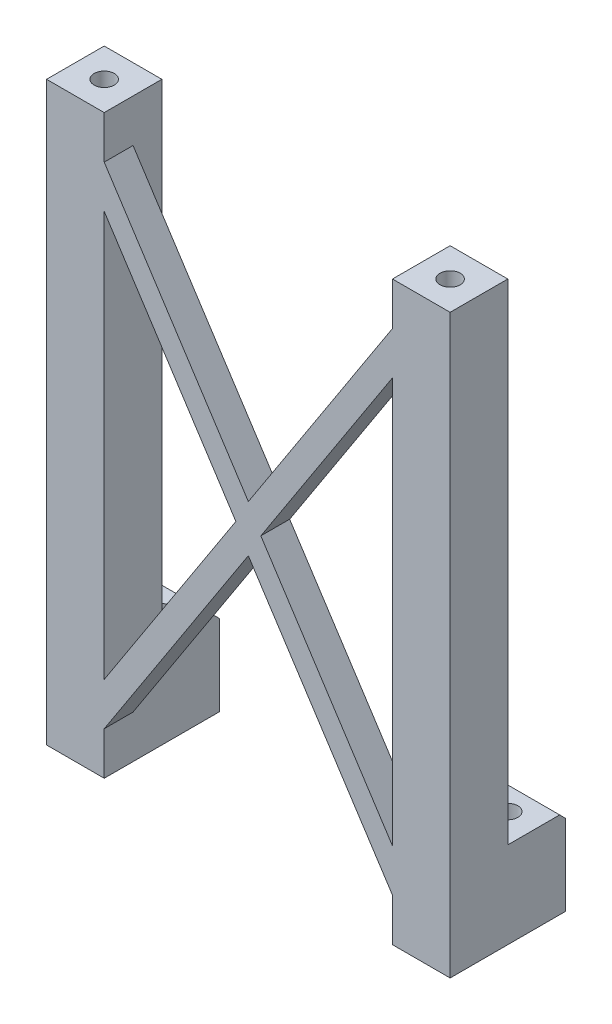
ISO-10303-21;
HEADER;
FILE_DESCRIPTION(('STEP AP214'),'2;1');
FILE_NAME('part.step','',(''),(''),'','','');
FILE_SCHEMA(('AUTOMOTIVE_DESIGN { 1 0 10303 214 1 1 1 1 }'));
ENDSEC;
DATA;
#1=APPLICATION_CONTEXT('core data for automotive mechanical design processes');
#2=APPLICATION_PROTOCOL_DEFINITION('international standard','automotive_design',2000,#1);
#3=PRODUCT_CONTEXT('',#1,'mechanical');
#4=PRODUCT('Part','Part','',(#3));
#5=PRODUCT_RELATED_PRODUCT_CATEGORY('part','',(#4));
#6=PRODUCT_DEFINITION_FORMATION('','',#4);
#7=PRODUCT_DEFINITION_CONTEXT('part definition',#1,'design');
#8=PRODUCT_DEFINITION('design','',#6,#7);
#9=PRODUCT_DEFINITION_SHAPE('','',#8);
#10=(LENGTH_UNIT() NAMED_UNIT(*) SI_UNIT(.MILLI.,.METRE.));
#11=(NAMED_UNIT(*) PLANE_ANGLE_UNIT() SI_UNIT($,.RADIAN.));
#12=(NAMED_UNIT(*) SI_UNIT($,.STERADIAN.) SOLID_ANGLE_UNIT());
#13=UNCERTAINTY_MEASURE_WITH_UNIT(LENGTH_MEASURE(1.E-05),#10,'distance_accuracy_value','');
#14=(GEOMETRIC_REPRESENTATION_CONTEXT(3) GLOBAL_UNCERTAINTY_ASSIGNED_CONTEXT((#13)) GLOBAL_UNIT_ASSIGNED_CONTEXT((#10,
#11,#12)) REPRESENTATION_CONTEXT('',''));
#15=CARTESIAN_POINT('',(0.,0.,0.));
#16=DIRECTION('',(0.,0.,1.));
#17=DIRECTION('',(1.,0.,0.));
#18=AXIS2_PLACEMENT_3D('',#15,#16,#17);
#19=CARTESIAN_POINT('',(25.,50.,-5.));
#20=DIRECTION('',(1.,0.,0.));
#21=DIRECTION('',(0.,0.,-1.));
#22=AXIS2_PLACEMENT_3D('',#19,#20,#21);
#23=PLANE('',#22);
#24=DIRECTION('',(0.,0.,-1.));
#25=VECTOR('',#24,1.);
#26=CARTESIAN_POINT('',(25.,-35.,-5.));
#27=LINE('',#26,#25);
#28=CARTESIAN_POINT('',(25.,-35.,-5.));
#29=VERTEX_POINT('',#28);
#30=CARTESIAN_POINT('',(25.,-35.,-14.));
#31=VERTEX_POINT('',#30);
#32=EDGE_CURVE('E258',#29,#31,#27,.T.);
#33=ORIENTED_EDGE('',*,*,#32,.T.);
#34=DIRECTION('',(0.,0.707106781186543,0.707106781186552));
#35=VECTOR('',#34,1.);
#36=CARTESIAN_POINT('',(25.,-36.,-15.));
#37=LINE('',#36,#35);
#38=CARTESIAN_POINT('',(25.,-36.,-15.));
#39=VERTEX_POINT('',#38);
#40=EDGE_CURVE('E11',#31,#39,#37,.F.);
#41=ORIENTED_EDGE('',*,*,#40,.T.);
#42=DIRECTION('',(0.,-1.,0.));
#43=VECTOR('',#42,1.);
#44=CARTESIAN_POINT('',(25.,-35.,-15.));
#45=LINE('',#44,#43);
#46=CARTESIAN_POINT('',(25.,-50.,-15.));
#47=VERTEX_POINT('',#46);
#48=EDGE_CURVE('E260',#39,#47,#45,.T.);
#49=ORIENTED_EDGE('',*,*,#48,.T.);
#50=DIRECTION('',(0.,0.,1.));
#51=VECTOR('',#50,1.);
#52=CARTESIAN_POINT('',(25.,-50.,-5.));
#53=LINE('',#52,#51);
#54=CARTESIAN_POINT('',(25.,-50.,5.));
#55=VERTEX_POINT('',#54);
#56=EDGE_CURVE('E294',#47,#55,#53,.T.);
#57=ORIENTED_EDGE('',*,*,#56,.T.);
#58=DIRECTION('',(0.,1.,0.));
#59=VECTOR('',#58,1.);
#60=CARTESIAN_POINT('',(25.,-50.,5.));
#61=LINE('',#60,#59);
#62=CARTESIAN_POINT('',(25.,-42.5553559480448,5.));
#63=VERTEX_POINT('',#62);
#64=EDGE_CURVE('E300',#55,#63,#61,.T.);
#65=ORIENTED_EDGE('',*,*,#64,.T.);
#66=DIRECTION('',(0.,0.,-1.));
#67=VECTOR('',#66,1.);
#68=CARTESIAN_POINT('',(25.,-42.5553559480448,54.3554284741283));
#69=LINE('',#68,#67);
#70=CARTESIAN_POINT('',(25.,-42.5553559480448,0.));
#71=VERTEX_POINT('',#70);
#72=EDGE_CURVE('E281',#63,#71,#69,.T.);
#73=ORIENTED_EDGE('',*,*,#72,.T.);
#74=DIRECTION('',(0.,-1.,0.));
#75=VECTOR('',#74,1.);
#76=CARTESIAN_POINT('',(25.,-42.5553559480448,0.));
#77=LINE('',#76,#75);
#78=CARTESIAN_POINT('',(25.,-35.1545796982905,0.));
#79=VERTEX_POINT('',#78);
#80=EDGE_CURVE('E275',#79,#71,#77,.T.);
#81=ORIENTED_EDGE('',*,*,#80,.F.);
#82=DIRECTION('',(0.,0.,-1.));
#83=VECTOR('',#82,1.);
#84=CARTESIAN_POINT('',(25.,-35.1545796982905,54.3554284741283));
#85=LINE('',#84,#83);
#86=CARTESIAN_POINT('',(25.,-35.1545796982905,5.));
#87=VERTEX_POINT('',#86);
#88=EDGE_CURVE('E284',#87,#79,#85,.T.);
#89=ORIENTED_EDGE('',*,*,#88,.F.);
#90=DIRECTION('',(0.,-1.,0.));
#91=VECTOR('',#90,1.);
#92=CARTESIAN_POINT('',(25.,50.,5.));
#93=LINE('',#92,#91);
#94=CARTESIAN_POINT('',(25.,35.1545796982905,5.));
#95=VERTEX_POINT('',#94);
#96=EDGE_CURVE('E335',#95,#87,#93,.T.);
#97=ORIENTED_EDGE('',*,*,#96,.F.);
#98=DIRECTION('',(0.,0.,-1.));
#99=VECTOR('',#98,1.);
#100=CARTESIAN_POINT('',(25.,35.1545796982905,54.3554284741283));
#101=LINE('',#100,#99);
#102=CARTESIAN_POINT('',(25.,35.1545796982905,0.));
#103=VERTEX_POINT('',#102);
#104=EDGE_CURVE('E307',#95,#103,#101,.T.);
#105=ORIENTED_EDGE('',*,*,#104,.T.);
#106=DIRECTION('',(0.,1.,0.));
#107=VECTOR('',#106,1.);
#108=CARTESIAN_POINT('',(25.,42.5553559480448,0.));
#109=LINE('',#108,#107);
#110=CARTESIAN_POINT('',(25.,42.5553559480448,0.));
#111=VERTEX_POINT('',#110);
#112=EDGE_CURVE('E312',#103,#111,#109,.T.);
#113=ORIENTED_EDGE('',*,*,#112,.T.);
#114=DIRECTION('',(0.,0.,-1.));
#115=VECTOR('',#114,1.);
#116=CARTESIAN_POINT('',(25.,42.5553559480448,54.3554284741283));
#117=LINE('',#116,#115);
#118=CARTESIAN_POINT('',(25.,42.5553559480448,5.));
#119=VERTEX_POINT('',#118);
#120=EDGE_CURVE('E317',#119,#111,#117,.T.);
#121=ORIENTED_EDGE('',*,*,#120,.F.);
#122=CARTESIAN_POINT('',(25.,50.,5.));
#123=VERTEX_POINT('',#122);
#124=EDGE_CURVE('E336',#123,#119,#93,.T.);
#125=ORIENTED_EDGE('',*,*,#124,.F.);
#126=DIRECTION('',(0.,0.,1.));
#127=VECTOR('',#126,1.);
#128=CARTESIAN_POINT('',(25.,50.,-5.));
#129=LINE('',#128,#127);
#130=CARTESIAN_POINT('',(25.,50.,-5.));
#131=VERTEX_POINT('',#130);
#132=EDGE_CURVE('E329',#131,#123,#129,.T.);
#133=ORIENTED_EDGE('',*,*,#132,.F.);
#134=DIRECTION('',(0.,-1.,0.));
#135=VECTOR('',#134,1.);
#136=CARTESIAN_POINT('',(25.,50.,-5.));
#137=LINE('',#136,#135);
#138=EDGE_CURVE('E339',#131,#29,#137,.T.);
#139=ORIENTED_EDGE('',*,*,#138,.T.);
#140=EDGE_LOOP('',(#33,#41,#49,#57,#65,#73,#81,#89,#97,#105,#113,#121,#125,#133,#139));
#141=FACE_BOUND('',#140,.T.);
#142=ADVANCED_FACE('F36',(#141),#23,.F.);
#143=CARTESIAN_POINT('',(0.,50.,0.));
#144=DIRECTION('',(0.,1.,0.));
#145=DIRECTION('',(0.,0.,1.));
#146=AXIS2_PLACEMENT_3D('',#143,#144,#145);
#147=PLANE('',#146);
#148=DIRECTION('',(0.,0.,-1.));
#149=VECTOR('',#148,1.);
#150=CARTESIAN_POINT('',(35.,50.,-5.));
#151=LINE('',#150,#149);
#152=CARTESIAN_POINT('',(35.,50.,5.));
#153=VERTEX_POINT('',#152);
#154=CARTESIAN_POINT('',(35.,50.,-5.));
#155=VERTEX_POINT('',#154);
#156=EDGE_CURVE('E324',#153,#155,#151,.T.);
#157=ORIENTED_EDGE('',*,*,#156,.T.);
#158=DIRECTION('',(-1.,0.,0.));
#159=VECTOR('',#158,1.);
#160=CARTESIAN_POINT('',(25.,50.,-5.));
#161=LINE('',#160,#159);
#162=EDGE_CURVE('E327',#155,#131,#161,.T.);
#163=ORIENTED_EDGE('',*,*,#162,.T.);
#164=ORIENTED_EDGE('',*,*,#132,.T.);
#165=DIRECTION('',(1.,0.,0.));
#166=VECTOR('',#165,1.);
#167=CARTESIAN_POINT('',(25.,50.,5.));
#168=LINE('',#167,#166);
#169=EDGE_CURVE('E331',#123,#153,#168,.T.);
#170=ORIENTED_EDGE('',*,*,#169,.T.);
#171=EDGE_LOOP('',(#157,#163,#164,#170));
#172=FACE_BOUND('',#171,.T.);
#173=CARTESIAN_POINT('',(30.,50.,0.));
#174=DIRECTION('',(0.,1.,0.));
#175=DIRECTION('',(0.,0.,1.));
#176=AXIS2_PLACEMENT_3D('',#173,#174,#175);
#177=CIRCLE('',#176,1.75);
#178=CARTESIAN_POINT('',(30.,50.,1.75));
#179=VERTEX_POINT('',#178);
#180=EDGE_CURVE('E310',#179,#179,#177,.T.);
#181=ORIENTED_EDGE('',*,*,#180,.F.);
#182=EDGE_LOOP('',(#181));
#183=FACE_BOUND('',#182,.T.);
#184=ADVANCED_FACE('F380',(#172,#183),#147,.T.);
#185=CARTESIAN_POINT('',(35.,50.,-5.));
#186=DIRECTION('',(-1.,0.,0.));
#187=DIRECTION('',(0.,0.,1.));
#188=AXIS2_PLACEMENT_3D('',#185,#186,#187);
#189=PLANE('',#188);
#190=DIRECTION('',(0.,-1.,0.));
#191=VECTOR('',#190,1.);
#192=CARTESIAN_POINT('',(35.,-35.,-15.));
#193=LINE('',#192,#191);
#194=CARTESIAN_POINT('',(35.,-36.,-15.));
#195=VERTEX_POINT('',#194);
#196=CARTESIAN_POINT('',(35.,-50.,-15.));
#197=VERTEX_POINT('',#196);
#198=EDGE_CURVE('E263',#195,#197,#193,.T.);
#199=ORIENTED_EDGE('',*,*,#198,.F.);
#200=DIRECTION('',(0.,-0.707106781186543,-0.707106781186552));
#201=VECTOR('',#200,1.);
#202=CARTESIAN_POINT('',(35.,-36.,-15.));
#203=LINE('',#202,#201);
#204=CARTESIAN_POINT('',(35.,-35.,-14.));
#205=VERTEX_POINT('',#204);
#206=EDGE_CURVE('E58',#195,#205,#203,.F.);
#207=ORIENTED_EDGE('',*,*,#206,.T.);
#208=DIRECTION('',(0.,0.,1.));
#209=VECTOR('',#208,1.);
#210=CARTESIAN_POINT('',(35.,-35.,-5.));
#211=LINE('',#210,#209);
#212=CARTESIAN_POINT('',(35.,-35.,-5.));
#213=VERTEX_POINT('',#212);
#214=EDGE_CURVE('E253',#205,#213,#211,.T.);
#215=ORIENTED_EDGE('',*,*,#214,.T.);
#216=DIRECTION('',(0.,-1.,0.));
#217=VECTOR('',#216,1.);
#218=CARTESIAN_POINT('',(35.,50.,-5.));
#219=LINE('',#218,#217);
#220=EDGE_CURVE('E342',#155,#213,#219,.T.);
#221=ORIENTED_EDGE('',*,*,#220,.F.);
#222=ORIENTED_EDGE('',*,*,#156,.F.);
#223=DIRECTION('',(0.,-1.,0.));
#224=VECTOR('',#223,1.);
#225=CARTESIAN_POINT('',(35.,50.,5.));
#226=LINE('',#225,#224);
#227=CARTESIAN_POINT('',(35.,-50.,5.));
#228=VERTEX_POINT('',#227);
#229=EDGE_CURVE('E333',#153,#228,#226,.T.);
#230=ORIENTED_EDGE('',*,*,#229,.T.);
#231=DIRECTION('',(0.,0.,-1.));
#232=VECTOR('',#231,1.);
#233=CARTESIAN_POINT('',(35.,-50.,-5.));
#234=LINE('',#233,#232);
#235=EDGE_CURVE('E291',#228,#197,#234,.T.);
#236=ORIENTED_EDGE('',*,*,#235,.T.);
#237=EDGE_LOOP('',(#199,#207,#215,#221,#222,#230,#236));
#238=FACE_BOUND('',#237,.T.);
#239=ADVANCED_FACE('F355',(#238),#189,.F.);
#240=CARTESIAN_POINT('',(25.,50.,-5.));
#241=DIRECTION('',(0.,0.,1.));
#242=DIRECTION('',(1.,0.,0.));
#243=AXIS2_PLACEMENT_3D('',#240,#241,#242);
#244=PLANE('',#243);
#245=ORIENTED_EDGE('',*,*,#220,.T.);
#246=DIRECTION('',(-1.,0.,0.));
#247=VECTOR('',#246,1.);
#248=CARTESIAN_POINT('',(35.,-35.,-5.));
#249=LINE('',#248,#247);
#250=EDGE_CURVE('E255',#213,#29,#249,.T.);
#251=ORIENTED_EDGE('',*,*,#250,.T.);
#252=ORIENTED_EDGE('',*,*,#138,.F.);
#253=ORIENTED_EDGE('',*,*,#162,.F.);
#254=EDGE_LOOP('',(#245,#251,#252,#253));
#255=FACE_BOUND('',#254,.T.);
#256=ADVANCED_FACE('F390',(#255),#244,.F.);
#257=CARTESIAN_POINT('',(25.,50.,5.));
#258=DIRECTION('',(0.,0.,-1.));
#259=DIRECTION('',(-1.,0.,0.));
#260=AXIS2_PLACEMENT_3D('',#257,#258,#259);
#261=PLANE('',#260);
#262=DIRECTION('',(1.,0.,0.));
#263=VECTOR('',#262,1.);
#264=CARTESIAN_POINT('',(25.,-50.,5.));
#265=LINE('',#264,#263);
#266=EDGE_CURVE('E297',#55,#228,#265,.T.);
#267=ORIENTED_EDGE('',*,*,#266,.T.);
#268=ORIENTED_EDGE('',*,*,#229,.F.);
#269=ORIENTED_EDGE('',*,*,#169,.F.);
#270=ORIENTED_EDGE('',*,*,#124,.T.);
#271=DIRECTION('',(0.544715045536134,0.838621201238418,0.));
#272=VECTOR('',#271,1.);
#273=CARTESIAN_POINT('',(0.,4.0663694536013,5.));
#274=LINE('',#273,#272);
#275=CARTESIAN_POINT('',(0.,4.0663694536013,5.00000000000001));
#276=VERTEX_POINT('',#275);
#277=EDGE_CURVE('E304',#276,#119,#274,.T.);
#278=ORIENTED_EDGE('',*,*,#277,.F.);
#279=DIRECTION('',(-0.544715045536134,0.838621201238418,0.));
#280=VECTOR('',#279,1.);
#281=CARTESIAN_POINT('',(0.,4.0663694536013,5.));
#282=LINE('',#281,#280);
#283=CARTESIAN_POINT('',(-25.,42.5553559480448,5.));
#284=VERTEX_POINT('',#283);
#285=EDGE_CURVE('E752',#276,#284,#282,.T.);
#286=ORIENTED_EDGE('',*,*,#285,.T.);
#287=DIRECTION('',(0.,-1.,0.));
#288=VECTOR('',#287,1.);
#289=CARTESIAN_POINT('',(-25.,50.,5.));
#290=LINE('',#289,#288);
#291=CARTESIAN_POINT('',(-25.,50.,5.));
#292=VERTEX_POINT('',#291);
#293=EDGE_CURVE('E237',#292,#284,#290,.T.);
#294=ORIENTED_EDGE('',*,*,#293,.F.);
#295=DIRECTION('',(-1.,0.,0.));
#296=VECTOR('',#295,1.);
#297=CARTESIAN_POINT('',(-25.,50.,5.));
#298=LINE('',#297,#296);
#299=CARTESIAN_POINT('',(-35.,50.,5.));
#300=VERTEX_POINT('',#299);
#301=EDGE_CURVE('E782',#292,#300,#298,.T.);
#302=ORIENTED_EDGE('',*,*,#301,.T.);
#303=DIRECTION('',(0.,-1.,0.));
#304=VECTOR('',#303,1.);
#305=CARTESIAN_POINT('',(-35.,50.,5.));
#306=LINE('',#305,#304);
#307=CARTESIAN_POINT('',(-35.,-50.,5.));
#308=VERTEX_POINT('',#307);
#309=EDGE_CURVE('E785',#300,#308,#306,.T.);
#310=ORIENTED_EDGE('',*,*,#309,.T.);
#311=DIRECTION('',(-1.,0.,0.));
#312=VECTOR('',#311,1.);
#313=CARTESIAN_POINT('',(-25.,-50.,5.));
#314=LINE('',#313,#312);
#315=CARTESIAN_POINT('',(-25.,-50.,5.));
#316=VERTEX_POINT('',#315);
#317=EDGE_CURVE('E746',#316,#308,#314,.T.);
#318=ORIENTED_EDGE('',*,*,#317,.F.);
#319=DIRECTION('',(0.,1.,0.));
#320=VECTOR('',#319,1.);
#321=CARTESIAN_POINT('',(-25.,-50.,5.));
#322=LINE('',#321,#320);
#323=CARTESIAN_POINT('',(-25.,-42.5553559480448,5.));
#324=VERTEX_POINT('',#323);
#325=EDGE_CURVE('E748',#316,#324,#322,.T.);
#326=ORIENTED_EDGE('',*,*,#325,.T.);
#327=DIRECTION('',(-0.544715045536134,-0.838621201238418,0.));
#328=VECTOR('',#327,1.);
#329=CARTESIAN_POINT('',(0.,-4.0663694536013,5.));
#330=LINE('',#329,#328);
#331=CARTESIAN_POINT('',(0.,-4.0663694536013,5.00000000000001));
#332=VERTEX_POINT('',#331);
#333=EDGE_CURVE('E717',#332,#324,#330,.T.);
#334=ORIENTED_EDGE('',*,*,#333,.F.);
#335=DIRECTION('',(0.544715045536134,-0.838621201238418,0.));
#336=VECTOR('',#335,1.);
#337=CARTESIAN_POINT('',(0.,-4.0663694536013,5.));
#338=LINE('',#337,#336);
#339=EDGE_CURVE('E267',#332,#63,#338,.T.);
#340=ORIENTED_EDGE('',*,*,#339,.T.);
#341=ORIENTED_EDGE('',*,*,#64,.F.);
#342=EDGE_LOOP('',(#267,#268,#269,#270,#278,#286,#294,#302,#310,#318,#326,#334,#340,#341));
#343=FACE_BOUND('',#342,.T.);
#344=ORIENTED_EDGE('',*,*,#96,.T.);
#345=DIRECTION('',(-0.544715045536134,0.838621201238418,0.));
#346=VECTOR('',#345,1.);
#347=CARTESIAN_POINT('',(25.,-35.1545796982905,5.));
#348=LINE('',#347,#346);
#349=CARTESIAN_POINT('',(2.16581878340338,0.,5.));
#350=VERTEX_POINT('',#349);
#351=EDGE_CURVE('E269',#87,#350,#348,.T.);
#352=ORIENTED_EDGE('',*,*,#351,.T.);
#353=DIRECTION('',(-0.544715045536134,-0.838621201238418,0.));
#354=VECTOR('',#353,1.);
#355=CARTESIAN_POINT('',(25.,35.1545796982905,5.));
#356=LINE('',#355,#354);
#357=EDGE_CURVE('E306',#95,#350,#356,.T.);
#358=ORIENTED_EDGE('',*,*,#357,.F.);
#359=EDGE_LOOP('',(#344,#352,#358));
#360=FACE_BOUND('',#359,.T.);
#361=CARTESIAN_POINT('',(-25.,35.1545796982905,5.));
#362=VERTEX_POINT('',#361);
#363=CARTESIAN_POINT('',(-25.,-35.1545796982905,5.));
#364=VERTEX_POINT('',#363);
#365=EDGE_CURVE('E787',#362,#364,#290,.T.);
#366=ORIENTED_EDGE('',*,*,#365,.F.);
#367=DIRECTION('',(0.544715045536134,-0.838621201238418,0.));
#368=VECTOR('',#367,1.);
#369=CARTESIAN_POINT('',(-25.,35.1545796982905,5.));
#370=LINE('',#369,#368);
#371=CARTESIAN_POINT('',(-2.16581878340338,0.,5.));
#372=VERTEX_POINT('',#371);
#373=EDGE_CURVE('E754',#362,#372,#370,.T.);
#374=ORIENTED_EDGE('',*,*,#373,.T.);
#375=DIRECTION('',(0.544715045536134,0.838621201238418,0.));
#376=VECTOR('',#375,1.);
#377=CARTESIAN_POINT('',(-25.,-35.1545796982905,5.));
#378=LINE('',#377,#376);
#379=EDGE_CURVE('E719',#364,#372,#378,.T.);
#380=ORIENTED_EDGE('',*,*,#379,.F.);
#381=EDGE_LOOP('',(#366,#374,#380));
#382=FACE_BOUND('',#381,.T.);
#383=ADVANCED_FACE('F389',(#343,#360,#382),#261,.F.);
#384=CARTESIAN_POINT('',(30.,50.,0.));
#385=DIRECTION('',(0.,-1.,0.));
#386=DIRECTION('',(0.,0.,-1.));
#387=AXIS2_PLACEMENT_3D('',#384,#385,#386);
#388=CYLINDRICAL_SURFACE('',#387,1.75);
#389=ORIENTED_EDGE('',*,*,#180,.T.);
#390=EDGE_LOOP('',(#389));
#391=FACE_BOUND('',#390,.T.);
#392=CARTESIAN_POINT('',(30.,-50.,0.));
#393=DIRECTION('',(0.,1.,0.));
#394=DIRECTION('',(0.,0.,1.));
#395=AXIS2_PLACEMENT_3D('',#392,#393,#394);
#396=CIRCLE('',#395,1.75);
#397=CARTESIAN_POINT('',(30.,-50.,1.75));
#398=VERTEX_POINT('',#397);
#399=EDGE_CURVE('E273',#398,#398,#396,.T.);
#400=ORIENTED_EDGE('',*,*,#399,.F.);
#401=EDGE_LOOP('',(#400));
#402=FACE_BOUND('',#401,.T.);
#403=ADVANCED_FACE('F412',(#391,#402),#388,.F.);
#404=CARTESIAN_POINT('',(0.,0.,0.));
#405=DIRECTION('',(0.,0.,-1.));
#406=DIRECTION('',(-1.,0.,0.));
#407=AXIS2_PLACEMENT_3D('',#404,#405,#406);
#408=PLANE('',#407);
#409=DIRECTION('',(0.544715045536134,0.838621201238418,0.));
#410=VECTOR('',#409,1.);
#411=CARTESIAN_POINT('',(25.,35.1545796982905,0.));
#412=LINE('',#411,#410);
#413=CARTESIAN_POINT('',(2.16581878340338,0.,0.));
#414=VERTEX_POINT('',#413);
#415=EDGE_CURVE('E303',#414,#103,#412,.T.);
#416=ORIENTED_EDGE('',*,*,#415,.F.);
#417=DIRECTION('',(0.544715045536134,-0.838621201238418,0.));
#418=VECTOR('',#417,1.);
#419=CARTESIAN_POINT('',(25.,-35.1545796982905,0.));
#420=LINE('',#419,#418);
#421=EDGE_CURVE('E265',#414,#79,#420,.T.);
#422=ORIENTED_EDGE('',*,*,#421,.T.);
#423=ORIENTED_EDGE('',*,*,#80,.T.);
#424=DIRECTION('',(-0.544715045536134,0.838621201238418,0.));
#425=VECTOR('',#424,1.);
#426=CARTESIAN_POINT('',(0.,-4.0663694536013,0.));
#427=LINE('',#426,#425);
#428=CARTESIAN_POINT('',(0.,-4.0663694536013,0.));
#429=VERTEX_POINT('',#428);
#430=EDGE_CURVE('E278',#71,#429,#427,.T.);
#431=ORIENTED_EDGE('',*,*,#430,.T.);
#432=DIRECTION('',(0.544715045536134,0.838621201238418,0.));
#433=VECTOR('',#432,1.);
#434=CARTESIAN_POINT('',(0.,-4.0663694536013,0.));
#435=LINE('',#434,#433);
#436=CARTESIAN_POINT('',(-25.,-42.5553559480448,0.));
#437=VERTEX_POINT('',#436);
#438=EDGE_CURVE('E728',#437,#429,#435,.T.);
#439=ORIENTED_EDGE('',*,*,#438,.F.);
#440=DIRECTION('',(0.,-1.,0.));
#441=VECTOR('',#440,1.);
#442=CARTESIAN_POINT('',(-25.,-42.5553559480448,0.));
#443=LINE('',#442,#441);
#444=CARTESIAN_POINT('',(-25.,-35.1545796982905,0.));
#445=VERTEX_POINT('',#444);
#446=EDGE_CURVE('E725',#445,#437,#443,.T.);
#447=ORIENTED_EDGE('',*,*,#446,.F.);
#448=DIRECTION('',(-0.544715045536134,-0.838621201238418,0.));
#449=VECTOR('',#448,1.);
#450=CARTESIAN_POINT('',(-25.,-35.1545796982905,0.));
#451=LINE('',#450,#449);
#452=CARTESIAN_POINT('',(-2.16581878340338,0.,0.));
#453=VERTEX_POINT('',#452);
#454=EDGE_CURVE('E712',#453,#445,#451,.T.);
#455=ORIENTED_EDGE('',*,*,#454,.F.);
#456=DIRECTION('',(-0.544715045536134,0.838621201238418,0.));
#457=VECTOR('',#456,1.);
#458=CARTESIAN_POINT('',(-25.,35.1545796982905,0.));
#459=LINE('',#458,#457);
#460=CARTESIAN_POINT('',(-25.,35.1545796982905,0.));
#461=VERTEX_POINT('',#460);
#462=EDGE_CURVE('E751',#453,#461,#459,.T.);
#463=ORIENTED_EDGE('',*,*,#462,.T.);
#464=DIRECTION('',(0.,1.,0.));
#465=VECTOR('',#464,1.);
#466=CARTESIAN_POINT('',(-25.,42.5553559480448,0.));
#467=LINE('',#466,#465);
#468=CARTESIAN_POINT('',(-25.,42.5553559480448,0.));
#469=VERTEX_POINT('',#468);
#470=EDGE_CURVE('E760',#461,#469,#467,.T.);
#471=ORIENTED_EDGE('',*,*,#470,.T.);
#472=DIRECTION('',(0.544715045536134,-0.838621201238418,0.));
#473=VECTOR('',#472,1.);
#474=CARTESIAN_POINT('',(0.,4.0663694536013,0.));
#475=LINE('',#474,#473);
#476=CARTESIAN_POINT('',(0.,4.0663694536013,0.));
#477=VERTEX_POINT('',#476);
#478=EDGE_CURVE('E763',#469,#477,#475,.T.);
#479=ORIENTED_EDGE('',*,*,#478,.T.);
#480=DIRECTION('',(-0.544715045536134,-0.838621201238418,0.));
#481=VECTOR('',#480,1.);
#482=CARTESIAN_POINT('',(0.,4.0663694536013,0.));
#483=LINE('',#482,#481);
#484=EDGE_CURVE('E315',#111,#477,#483,.T.);
#485=ORIENTED_EDGE('',*,*,#484,.F.);
#486=ORIENTED_EDGE('',*,*,#112,.F.);
#487=EDGE_LOOP('',(#416,#422,#423,#431,#439,#447,#455,#463,#471,#479,#485,#486));
#488=FACE_BOUND('',#487,.T.);
#489=ADVANCED_FACE('F421',(#488),#408,.T.);
#490=CARTESIAN_POINT('',(0.,4.0663694536013,54.3554284741283));
#491=DIRECTION('',(0.838621201238418,-0.544715045536134,0.));
#492=DIRECTION('',(0.544715045536134,0.838621201238418,0.));
#493=AXIS2_PLACEMENT_3D('',#490,#491,#492);
#494=PLANE('',#493);
#495=DIRECTION('',(0.,0.,-1.));
#496=VECTOR('',#495,1.);
#497=CARTESIAN_POINT('',(0.,4.0663694536013,54.3554284741283));
#498=LINE('',#497,#496);
#499=EDGE_CURVE('E766',#276,#477,#498,.T.);
#500=ORIENTED_EDGE('',*,*,#499,.F.);
#501=ORIENTED_EDGE('',*,*,#277,.T.);
#502=ORIENTED_EDGE('',*,*,#120,.T.);
#503=ORIENTED_EDGE('',*,*,#484,.T.);
#504=EDGE_LOOP('',(#500,#501,#502,#503));
#505=FACE_BOUND('',#504,.T.);
#506=ADVANCED_FACE('F430',(#505),#494,.F.);
#507=CARTESIAN_POINT('',(25.,35.1545796982905,54.3554284741283));
#508=DIRECTION('',(-0.838621201238418,0.544715045536134,0.));
#509=DIRECTION('',(-0.544715045536134,-0.838621201238418,0.));
#510=AXIS2_PLACEMENT_3D('',#507,#508,#509);
#511=PLANE('',#510);
#512=ORIENTED_EDGE('',*,*,#104,.F.);
#513=ORIENTED_EDGE('',*,*,#357,.T.);
#514=DIRECTION('',(0.,0.,-1.));
#515=VECTOR('',#514,1.);
#516=CARTESIAN_POINT('',(2.16581878340338,0.,54.3554284741283));
#517=LINE('',#516,#515);
#518=EDGE_CURVE('E270',#350,#414,#517,.T.);
#519=ORIENTED_EDGE('',*,*,#518,.T.);
#520=ORIENTED_EDGE('',*,*,#415,.T.);
#521=EDGE_LOOP('',(#512,#513,#519,#520));
#522=FACE_BOUND('',#521,.T.);
#523=ADVANCED_FACE('F438',(#522),#511,.F.);
#524=CARTESIAN_POINT('',(0.,-50.,0.));
#525=DIRECTION('',(0.,-1.,0.));
#526=DIRECTION('',(0.,0.,1.));
#527=AXIS2_PLACEMENT_3D('',#524,#525,#526);
#528=PLANE('',#527);
#529=ORIENTED_EDGE('',*,*,#235,.F.);
#530=ORIENTED_EDGE('',*,*,#266,.F.);
#531=ORIENTED_EDGE('',*,*,#56,.F.);
#532=DIRECTION('',(1.,0.,0.));
#533=VECTOR('',#532,1.);
#534=CARTESIAN_POINT('',(35.,-50.,-15.));
#535=LINE('',#534,#533);
#536=EDGE_CURVE('E250',#47,#197,#535,.T.);
#537=ORIENTED_EDGE('',*,*,#536,.T.);
#538=EDGE_LOOP('',(#529,#530,#531,#537));
#539=FACE_BOUND('',#538,.T.);
#540=ORIENTED_EDGE('',*,*,#399,.T.);
#541=EDGE_LOOP('',(#540));
#542=FACE_BOUND('',#541,.T.);
#543=CARTESIAN_POINT('',(30.,-50.,-10.));
#544=DIRECTION('',(0.,-1.,0.));
#545=DIRECTION('',(0.,0.,-1.));
#546=AXIS2_PLACEMENT_3D('',#543,#544,#545);
#547=CIRCLE('',#546,1.75);
#548=CARTESIAN_POINT('',(30.,-50.,-11.75));
#549=VERTEX_POINT('',#548);
#550=EDGE_CURVE('E246',#549,#549,#547,.T.);
#551=ORIENTED_EDGE('',*,*,#550,.F.);
#552=EDGE_LOOP('',(#551));
#553=FACE_BOUND('',#552,.T.);
#554=ADVANCED_FACE('F361',(#539,#542,#553),#528,.T.);
#555=CARTESIAN_POINT('',(0.,-4.0663694536013,54.3554284741283));
#556=DIRECTION('',(0.838621201238418,0.544715045536134,0.));
#557=DIRECTION('',(0.544715045536134,-0.838621201238418,0.));
#558=AXIS2_PLACEMENT_3D('',#555,#556,#557);
#559=PLANE('',#558);
#560=DIRECTION('',(0.,0.,-1.));
#561=VECTOR('',#560,1.);
#562=CARTESIAN_POINT('',(0.,-4.0663694536013,54.3554284741283));
#563=LINE('',#562,#561);
#564=EDGE_CURVE('E731',#332,#429,#563,.T.);
#565=ORIENTED_EDGE('',*,*,#564,.T.);
#566=ORIENTED_EDGE('',*,*,#430,.F.);
#567=ORIENTED_EDGE('',*,*,#72,.F.);
#568=ORIENTED_EDGE('',*,*,#339,.F.);
#569=EDGE_LOOP('',(#565,#566,#567,#568));
#570=FACE_BOUND('',#569,.T.);
#571=ADVANCED_FACE('F457',(#570),#559,.F.);
#572=CARTESIAN_POINT('',(25.,-35.1545796982905,54.3554284741283));
#573=DIRECTION('',(-0.838621201238418,-0.544715045536134,0.));
#574=DIRECTION('',(-0.544715045536134,0.838621201238418,0.));
#575=AXIS2_PLACEMENT_3D('',#572,#573,#574);
#576=PLANE('',#575);
#577=ORIENTED_EDGE('',*,*,#88,.T.);
#578=ORIENTED_EDGE('',*,*,#421,.F.);
#579=ORIENTED_EDGE('',*,*,#518,.F.);
#580=ORIENTED_EDGE('',*,*,#351,.F.);
#581=EDGE_LOOP('',(#577,#578,#579,#580));
#582=FACE_BOUND('',#581,.T.);
#583=ADVANCED_FACE('F464',(#582),#576,.F.);
#584=CARTESIAN_POINT('',(35.,-35.,-15.));
#585=DIRECTION('',(0.,0.,-1.));
#586=DIRECTION('',(-1.,0.,0.));
#587=AXIS2_PLACEMENT_3D('',#584,#585,#586);
#588=PLANE('',#587);
#589=ORIENTED_EDGE('',*,*,#48,.F.);
#590=DIRECTION('',(1.,0.,0.));
#591=VECTOR('',#590,1.);
#592=CARTESIAN_POINT('',(35.,-36.,-15.));
#593=LINE('',#592,#591);
#594=EDGE_CURVE('E345',#39,#195,#593,.T.);
#595=ORIENTED_EDGE('',*,*,#594,.T.);
#596=ORIENTED_EDGE('',*,*,#198,.T.);
#597=ORIENTED_EDGE('',*,*,#536,.F.);
#598=EDGE_LOOP('',(#589,#595,#596,#597));
#599=FACE_BOUND('',#598,.T.);
#600=ADVANCED_FACE('F351',(#599),#588,.T.);
#601=CARTESIAN_POINT('',(0.,-35.,0.));
#602=DIRECTION('',(0.,1.,0.));
#603=DIRECTION('',(0.,0.,1.));
#604=AXIS2_PLACEMENT_3D('',#601,#602,#603);
#605=PLANE('',#604);
#606=CARTESIAN_POINT('',(30.,-35.,-10.));
#607=DIRECTION('',(0.,-1.,0.));
#608=DIRECTION('',(0.,0.,-1.));
#609=AXIS2_PLACEMENT_3D('',#606,#607,#608);
#610=CIRCLE('',#609,1.75);
#611=CARTESIAN_POINT('',(30.,-35.,-11.75));
#612=VERTEX_POINT('',#611);
#613=EDGE_CURVE('E247',#612,#612,#610,.T.);
#614=ORIENTED_EDGE('',*,*,#613,.T.);
#615=EDGE_LOOP('',(#614));
#616=FACE_BOUND('',#615,.T.);
#617=ORIENTED_EDGE('',*,*,#214,.F.);
#618=DIRECTION('',(-1.,0.,0.));
#619=VECTOR('',#618,1.);
#620=CARTESIAN_POINT('',(0.,-35.,-14.));
#621=LINE('',#620,#619);
#622=EDGE_CURVE('E44',#205,#31,#621,.T.);
#623=ORIENTED_EDGE('',*,*,#622,.T.);
#624=ORIENTED_EDGE('',*,*,#32,.F.);
#625=ORIENTED_EDGE('',*,*,#250,.F.);
#626=EDGE_LOOP('',(#617,#623,#624,#625));
#627=FACE_BOUND('',#626,.T.);
#628=ADVANCED_FACE('F376',(#616,#627),#605,.T.);
#629=CARTESIAN_POINT('',(30.,-35.,-10.));
#630=DIRECTION('',(0.,-1.,0.));
#631=DIRECTION('',(0.,0.,-1.));
#632=AXIS2_PLACEMENT_3D('',#629,#630,#631);
#633=CYLINDRICAL_SURFACE('',#632,1.75);
#634=ORIENTED_EDGE('',*,*,#613,.F.);
#635=EDGE_LOOP('',(#634));
#636=FACE_BOUND('',#635,.T.);
#637=ORIENTED_EDGE('',*,*,#550,.T.);
#638=EDGE_LOOP('',(#637));
#639=FACE_BOUND('',#638,.T.);
#640=ADVANCED_FACE('F368',(#636,#639),#633,.F.);
#641=CARTESIAN_POINT('',(35.,-36.,-15.));
#642=DIRECTION('',(0.,-0.707106781186552,0.707106781186543));
#643=DIRECTION('',(1.,0.,0.));
#644=AXIS2_PLACEMENT_3D('',#641,#642,#643);
#645=PLANE('',#644);
#646=ORIENTED_EDGE('',*,*,#40,.F.);
#647=ORIENTED_EDGE('',*,*,#622,.F.);
#648=ORIENTED_EDGE('',*,*,#206,.F.);
#649=ORIENTED_EDGE('',*,*,#594,.F.);
#650=EDGE_LOOP('',(#646,#647,#648,#649));
#651=FACE_BOUND('',#650,.T.);
#652=ADVANCED_FACE('F38',(#651),#645,.F.);
#653=CARTESIAN_POINT('',(-25.,50.,-5.));
#654=DIRECTION('',(-1.,0.,0.));
#655=DIRECTION('',(0.,0.,-1.));
#656=AXIS2_PLACEMENT_3D('',#653,#654,#655);
#657=PLANE('',#656);
#658=DIRECTION('',(0.,0.,-1.));
#659=VECTOR('',#658,1.);
#660=CARTESIAN_POINT('',(-25.,-35.,-5.));
#661=LINE('',#660,#659);
#662=CARTESIAN_POINT('',(-25.,-35.,-5.));
#663=VERTEX_POINT('',#662);
#664=CARTESIAN_POINT('',(-25.,-35.,-14.));
#665=VERTEX_POINT('',#664);
#666=EDGE_CURVE('E217',#663,#665,#661,.T.);
#667=ORIENTED_EDGE('',*,*,#666,.F.);
#668=DIRECTION('',(0.,-1.,0.));
#669=VECTOR('',#668,1.);
#670=CARTESIAN_POINT('',(-25.,50.,-5.));
#671=LINE('',#670,#669);
#672=CARTESIAN_POINT('',(-25.,50.,-5.));
#673=VERTEX_POINT('',#672);
#674=EDGE_CURVE('E213',#673,#663,#671,.T.);
#675=ORIENTED_EDGE('',*,*,#674,.F.);
#676=DIRECTION('',(0.,0.,1.));
#677=VECTOR('',#676,1.);
#678=CARTESIAN_POINT('',(-25.,50.,-5.));
#679=LINE('',#678,#677);
#680=EDGE_CURVE('E779',#673,#292,#679,.T.);
#681=ORIENTED_EDGE('',*,*,#680,.T.);
#682=ORIENTED_EDGE('',*,*,#293,.T.);
#683=DIRECTION('',(0.,0.,-1.));
#684=VECTOR('',#683,1.);
#685=CARTESIAN_POINT('',(-25.,42.5553559480448,54.3554284741283));
#686=LINE('',#685,#684);
#687=EDGE_CURVE('E769',#284,#469,#686,.T.);
#688=ORIENTED_EDGE('',*,*,#687,.T.);
#689=ORIENTED_EDGE('',*,*,#470,.F.);
#690=DIRECTION('',(0.,0.,-1.));
#691=VECTOR('',#690,1.);
#692=CARTESIAN_POINT('',(-25.,35.1545796982905,54.3554284741283));
#693=LINE('',#692,#691);
#694=EDGE_CURVE('E755',#362,#461,#693,.T.);
#695=ORIENTED_EDGE('',*,*,#694,.F.);
#696=ORIENTED_EDGE('',*,*,#365,.T.);
#697=DIRECTION('',(0.,0.,-1.));
#698=VECTOR('',#697,1.);
#699=CARTESIAN_POINT('',(-25.,-35.1545796982905,54.3554284741283));
#700=LINE('',#699,#698);
#701=EDGE_CURVE('E736',#364,#445,#700,.T.);
#702=ORIENTED_EDGE('',*,*,#701,.T.);
#703=ORIENTED_EDGE('',*,*,#446,.T.);
#704=DIRECTION('',(0.,0.,-1.));
#705=VECTOR('',#704,1.);
#706=CARTESIAN_POINT('',(-25.,-42.5553559480448,54.3554284741283));
#707=LINE('',#706,#705);
#708=EDGE_CURVE('E733',#324,#437,#707,.T.);
#709=ORIENTED_EDGE('',*,*,#708,.F.);
#710=ORIENTED_EDGE('',*,*,#325,.F.);
#711=DIRECTION('',(0.,0.,1.));
#712=VECTOR('',#711,1.);
#713=CARTESIAN_POINT('',(-25.,-50.,-5.));
#714=LINE('',#713,#712);
#715=CARTESIAN_POINT('',(-25.,-50.,-15.));
#716=VERTEX_POINT('',#715);
#717=EDGE_CURVE('E709',#716,#316,#714,.T.);
#718=ORIENTED_EDGE('',*,*,#717,.F.);
#719=DIRECTION('',(0.,-1.,0.));
#720=VECTOR('',#719,1.);
#721=CARTESIAN_POINT('',(-25.,-35.,-15.));
#722=LINE('',#721,#720);
#723=CARTESIAN_POINT('',(-25.,-36.,-15.));
#724=VERTEX_POINT('',#723);
#725=EDGE_CURVE('E706',#724,#716,#722,.T.);
#726=ORIENTED_EDGE('',*,*,#725,.F.);
#727=DIRECTION('',(0.,0.707106781186543,0.707106781186552));
#728=VECTOR('',#727,1.);
#729=CARTESIAN_POINT('',(-25.,-36.,-15.));
#730=LINE('',#729,#728);
#731=EDGE_CURVE('E243',#665,#724,#730,.F.);
#732=ORIENTED_EDGE('',*,*,#731,.F.);
#733=EDGE_LOOP('',(#667,#675,#681,#682,#688,#689,#695,#696,#702,#703,#709,#710,#718,#726,#732));
#734=FACE_BOUND('',#733,.T.);
#735=ADVANCED_FACE('F367',(#734),#657,.F.);
#736=CARTESIAN_POINT('',(0.,50.,0.));
#737=DIRECTION('',(0.,1.,0.));
#738=DIRECTION('',(0.,0.,1.));
#739=AXIS2_PLACEMENT_3D('',#736,#737,#738);
#740=PLANE('',#739);
#741=DIRECTION('',(0.,0.,-1.));
#742=VECTOR('',#741,1.);
#743=CARTESIAN_POINT('',(-35.,50.,-5.));
#744=LINE('',#743,#742);
#745=CARTESIAN_POINT('',(-35.,50.,-5.));
#746=VERTEX_POINT('',#745);
#747=EDGE_CURVE('E232',#300,#746,#744,.T.);
#748=ORIENTED_EDGE('',*,*,#747,.F.);
#749=ORIENTED_EDGE('',*,*,#301,.F.);
#750=ORIENTED_EDGE('',*,*,#680,.F.);
#751=DIRECTION('',(1.,0.,0.));
#752=VECTOR('',#751,1.);
#753=CARTESIAN_POINT('',(-25.,50.,-5.));
#754=LINE('',#753,#752);
#755=EDGE_CURVE('E777',#746,#673,#754,.T.);
#756=ORIENTED_EDGE('',*,*,#755,.F.);
#757=EDGE_LOOP('',(#748,#749,#750,#756));
#758=FACE_BOUND('',#757,.T.);
#759=CARTESIAN_POINT('',(-30.,50.,0.));
#760=DIRECTION('',(0.,-1.,0.));
#761=DIRECTION('',(0.,0.,1.));
#762=AXIS2_PLACEMENT_3D('',#759,#760,#761);
#763=CIRCLE('',#762,1.75);
#764=CARTESIAN_POINT('',(-30.,50.,1.75));
#765=VERTEX_POINT('',#764);
#766=EDGE_CURVE('E758',#765,#765,#763,.T.);
#767=ORIENTED_EDGE('',*,*,#766,.T.);
#768=EDGE_LOOP('',(#767));
#769=FACE_BOUND('',#768,.T.);
#770=ADVANCED_FACE('F373',(#758,#769),#740,.T.);
#771=CARTESIAN_POINT('',(-35.,50.,-5.));
#772=DIRECTION('',(1.,0.,0.));
#773=DIRECTION('',(0.,0.,1.));
#774=AXIS2_PLACEMENT_3D('',#771,#772,#773);
#775=PLANE('',#774);
#776=DIRECTION('',(0.,-1.,0.));
#777=VECTOR('',#776,1.);
#778=CARTESIAN_POINT('',(-35.,-35.,-15.));
#779=LINE('',#778,#777);
#780=CARTESIAN_POINT('',(-35.,-36.,-15.));
#781=VERTEX_POINT('',#780);
#782=CARTESIAN_POINT('',(-35.,-50.,-15.));
#783=VERTEX_POINT('',#782);
#784=EDGE_CURVE('E710',#781,#783,#779,.T.);
#785=ORIENTED_EDGE('',*,*,#784,.T.);
#786=DIRECTION('',(0.,0.,-1.));
#787=VECTOR('',#786,1.);
#788=CARTESIAN_POINT('',(-35.,-50.,-5.));
#789=LINE('',#788,#787);
#790=EDGE_CURVE('E742',#308,#783,#789,.T.);
#791=ORIENTED_EDGE('',*,*,#790,.F.);
#792=ORIENTED_EDGE('',*,*,#309,.F.);
#793=ORIENTED_EDGE('',*,*,#747,.T.);
#794=DIRECTION('',(0.,-1.,0.));
#795=VECTOR('',#794,1.);
#796=CARTESIAN_POINT('',(-35.,50.,-5.));
#797=LINE('',#796,#795);
#798=CARTESIAN_POINT('',(-35.,-35.,-5.));
#799=VERTEX_POINT('',#798);
#800=EDGE_CURVE('E210',#746,#799,#797,.T.);
#801=ORIENTED_EDGE('',*,*,#800,.T.);
#802=DIRECTION('',(0.,0.,1.));
#803=VECTOR('',#802,1.);
#804=CARTESIAN_POINT('',(-35.,-35.,-5.));
#805=LINE('',#804,#803);
#806=CARTESIAN_POINT('',(-35.,-35.,-14.));
#807=VERTEX_POINT('',#806);
#808=EDGE_CURVE('E218',#807,#799,#805,.T.);
#809=ORIENTED_EDGE('',*,*,#808,.F.);
#810=DIRECTION('',(0.,-0.707106781186543,-0.707106781186552));
#811=VECTOR('',#810,1.);
#812=CARTESIAN_POINT('',(-35.,-36.,-15.));
#813=LINE('',#812,#811);
#814=EDGE_CURVE('E235',#781,#807,#813,.F.);
#815=ORIENTED_EDGE('',*,*,#814,.F.);
#816=EDGE_LOOP('',(#785,#791,#792,#793,#801,#809,#815));
#817=FACE_BOUND('',#816,.T.);
#818=ADVANCED_FACE('F230',(#817),#775,.F.);
#819=CARTESIAN_POINT('',(-25.,50.,-5.));
#820=DIRECTION('',(0.,0.,1.));
#821=DIRECTION('',(-1.,0.,0.));
#822=AXIS2_PLACEMENT_3D('',#819,#820,#821);
#823=PLANE('',#822);
#824=ORIENTED_EDGE('',*,*,#800,.F.);
#825=ORIENTED_EDGE('',*,*,#755,.T.);
#826=ORIENTED_EDGE('',*,*,#674,.T.);
#827=DIRECTION('',(1.,0.,0.));
#828=VECTOR('',#827,1.);
#829=CARTESIAN_POINT('',(-35.,-35.,-5.));
#830=LINE('',#829,#828);
#831=EDGE_CURVE('E206',#799,#663,#830,.T.);
#832=ORIENTED_EDGE('',*,*,#831,.F.);
#833=EDGE_LOOP('',(#824,#825,#826,#832));
#834=FACE_BOUND('',#833,.T.);
#835=ADVANCED_FACE('F208',(#834),#823,.F.);
#836=CARTESIAN_POINT('',(-30.,50.,0.));
#837=DIRECTION('',(0.,-1.,0.));
#838=DIRECTION('',(0.,0.,-1.));
#839=AXIS2_PLACEMENT_3D('',#836,#837,#838);
#840=CYLINDRICAL_SURFACE('',#839,1.75);
#841=ORIENTED_EDGE('',*,*,#766,.F.);
#842=EDGE_LOOP('',(#841));
#843=FACE_BOUND('',#842,.T.);
#844=CARTESIAN_POINT('',(-30.,-50.,0.));
#845=DIRECTION('',(0.,-1.,0.));
#846=DIRECTION('',(0.,0.,1.));
#847=AXIS2_PLACEMENT_3D('',#844,#845,#846);
#848=CIRCLE('',#847,1.75);
#849=CARTESIAN_POINT('',(-30.,-50.,1.75));
#850=VERTEX_POINT('',#849);
#851=EDGE_CURVE('E723',#850,#850,#848,.T.);
#852=ORIENTED_EDGE('',*,*,#851,.T.);
#853=EDGE_LOOP('',(#852));
#854=FACE_BOUND('',#853,.T.);
#855=ADVANCED_FACE('F589',(#843,#854),#840,.F.);
#856=CARTESIAN_POINT('',(0.,4.0663694536013,54.3554284741283));
#857=DIRECTION('',(-0.838621201238418,-0.544715045536134,0.));
#858=DIRECTION('',(-0.544715045536134,0.838621201238418,0.));
#859=AXIS2_PLACEMENT_3D('',#856,#857,#858);
#860=PLANE('',#859);
#861=ORIENTED_EDGE('',*,*,#499,.T.);
#862=ORIENTED_EDGE('',*,*,#478,.F.);
#863=ORIENTED_EDGE('',*,*,#687,.F.);
#864=ORIENTED_EDGE('',*,*,#285,.F.);
#865=EDGE_LOOP('',(#861,#862,#863,#864));
#866=FACE_BOUND('',#865,.T.);
#867=ADVANCED_FACE('F600',(#866),#860,.F.);
#868=CARTESIAN_POINT('',(-25.,35.1545796982905,54.3554284741283));
#869=DIRECTION('',(0.838621201238418,0.544715045536134,0.));
#870=DIRECTION('',(0.544715045536134,-0.838621201238418,0.));
#871=AXIS2_PLACEMENT_3D('',#868,#869,#870);
#872=PLANE('',#871);
#873=ORIENTED_EDGE('',*,*,#694,.T.);
#874=ORIENTED_EDGE('',*,*,#462,.F.);
#875=DIRECTION('',(0.,0.,-1.));
#876=VECTOR('',#875,1.);
#877=CARTESIAN_POINT('',(-2.16581878340338,0.,54.3554284741283));
#878=LINE('',#877,#876);
#879=EDGE_CURVE('E720',#372,#453,#878,.T.);
#880=ORIENTED_EDGE('',*,*,#879,.F.);
#881=ORIENTED_EDGE('',*,*,#373,.F.);
#882=EDGE_LOOP('',(#873,#874,#880,#881));
#883=FACE_BOUND('',#882,.T.);
#884=ADVANCED_FACE('F612',(#883),#872,.F.);
#885=CARTESIAN_POINT('',(0.,-50.,0.));
#886=DIRECTION('',(0.,-1.,0.));
#887=DIRECTION('',(0.,0.,1.));
#888=AXIS2_PLACEMENT_3D('',#885,#886,#887);
#889=PLANE('',#888);
#890=ORIENTED_EDGE('',*,*,#790,.T.);
#891=DIRECTION('',(-1.,0.,0.));
#892=VECTOR('',#891,1.);
#893=CARTESIAN_POINT('',(-35.,-50.,-15.));
#894=LINE('',#893,#892);
#895=EDGE_CURVE('E226',#716,#783,#894,.T.);
#896=ORIENTED_EDGE('',*,*,#895,.F.);
#897=ORIENTED_EDGE('',*,*,#717,.T.);
#898=ORIENTED_EDGE('',*,*,#317,.T.);
#899=EDGE_LOOP('',(#890,#896,#897,#898));
#900=FACE_BOUND('',#899,.T.);
#901=ORIENTED_EDGE('',*,*,#851,.F.);
#902=EDGE_LOOP('',(#901));
#903=FACE_BOUND('',#902,.T.);
#904=CARTESIAN_POINT('',(-30.,-50.,-10.));
#905=DIRECTION('',(0.,1.,0.));
#906=DIRECTION('',(0.,0.,-1.));
#907=AXIS2_PLACEMENT_3D('',#904,#905,#906);
#908=CIRCLE('',#907,1.75);
#909=CARTESIAN_POINT('',(-30.,-50.,-11.75));
#910=VERTEX_POINT('',#909);
#911=EDGE_CURVE('E809',#910,#910,#908,.T.);
#912=ORIENTED_EDGE('',*,*,#911,.T.);
#913=EDGE_LOOP('',(#912));
#914=FACE_BOUND('',#913,.T.);
#915=ADVANCED_FACE('F621',(#900,#903,#914),#889,.T.);
#916=CARTESIAN_POINT('',(0.,-4.0663694536013,54.3554284741283));
#917=DIRECTION('',(-0.838621201238418,0.544715045536134,0.));
#918=DIRECTION('',(-0.544715045536134,-0.838621201238418,0.));
#919=AXIS2_PLACEMENT_3D('',#916,#917,#918);
#920=PLANE('',#919);
#921=ORIENTED_EDGE('',*,*,#564,.F.);
#922=ORIENTED_EDGE('',*,*,#333,.T.);
#923=ORIENTED_EDGE('',*,*,#708,.T.);
#924=ORIENTED_EDGE('',*,*,#438,.T.);
#925=EDGE_LOOP('',(#921,#922,#923,#924));
#926=FACE_BOUND('',#925,.T.);
#927=ADVANCED_FACE('F630',(#926),#920,.F.);
#928=CARTESIAN_POINT('',(-25.,-35.1545796982905,54.3554284741283));
#929=DIRECTION('',(0.838621201238418,-0.544715045536134,0.));
#930=DIRECTION('',(0.544715045536134,0.838621201238418,0.));
#931=AXIS2_PLACEMENT_3D('',#928,#929,#930);
#932=PLANE('',#931);
#933=ORIENTED_EDGE('',*,*,#701,.F.);
#934=ORIENTED_EDGE('',*,*,#379,.T.);
#935=ORIENTED_EDGE('',*,*,#879,.T.);
#936=ORIENTED_EDGE('',*,*,#454,.T.);
#937=EDGE_LOOP('',(#933,#934,#935,#936));
#938=FACE_BOUND('',#937,.T.);
#939=ADVANCED_FACE('F642',(#938),#932,.F.);
#940=CARTESIAN_POINT('',(-35.,-35.,-15.));
#941=DIRECTION('',(0.,0.,-1.));
#942=DIRECTION('',(1.,0.,0.));
#943=AXIS2_PLACEMENT_3D('',#940,#941,#942);
#944=PLANE('',#943);
#945=ORIENTED_EDGE('',*,*,#725,.T.);
#946=ORIENTED_EDGE('',*,*,#895,.T.);
#947=ORIENTED_EDGE('',*,*,#784,.F.);
#948=DIRECTION('',(-1.,0.,0.));
#949=VECTOR('',#948,1.);
#950=CARTESIAN_POINT('',(-35.,-36.,-15.));
#951=LINE('',#950,#949);
#952=EDGE_CURVE('E233',#724,#781,#951,.T.);
#953=ORIENTED_EDGE('',*,*,#952,.F.);
#954=EDGE_LOOP('',(#945,#946,#947,#953));
#955=FACE_BOUND('',#954,.T.);
#956=ADVANCED_FACE('F651',(#955),#944,.T.);
#957=CARTESIAN_POINT('',(0.,-35.,0.));
#958=DIRECTION('',(0.,1.,0.));
#959=DIRECTION('',(0.,0.,1.));
#960=AXIS2_PLACEMENT_3D('',#957,#958,#959);
#961=PLANE('',#960);
#962=CARTESIAN_POINT('',(-30.,-35.,-10.));
#963=DIRECTION('',(0.,1.,0.));
#964=DIRECTION('',(0.,0.,-1.));
#965=AXIS2_PLACEMENT_3D('',#962,#963,#964);
#966=CIRCLE('',#965,1.75);
#967=CARTESIAN_POINT('',(-30.,-35.,-11.75));
#968=VERTEX_POINT('',#967);
#969=EDGE_CURVE('E807',#968,#968,#966,.T.);
#970=ORIENTED_EDGE('',*,*,#969,.F.);
#971=EDGE_LOOP('',(#970));
#972=FACE_BOUND('',#971,.T.);
#973=ORIENTED_EDGE('',*,*,#808,.T.);
#974=ORIENTED_EDGE('',*,*,#831,.T.);
#975=ORIENTED_EDGE('',*,*,#666,.T.);
#976=DIRECTION('',(1.,0.,0.));
#977=VECTOR('',#976,1.);
#978=CARTESIAN_POINT('',(0.,-35.,-14.));
#979=LINE('',#978,#977);
#980=EDGE_CURVE('E222',#807,#665,#979,.T.);
#981=ORIENTED_EDGE('',*,*,#980,.F.);
#982=EDGE_LOOP('',(#973,#974,#975,#981));
#983=FACE_BOUND('',#982,.T.);
#984=ADVANCED_FACE('F221',(#972,#983),#961,.T.);
#985=CARTESIAN_POINT('',(-30.,-35.,-10.));
#986=DIRECTION('',(0.,-1.,0.));
#987=DIRECTION('',(0.,0.,-1.));
#988=AXIS2_PLACEMENT_3D('',#985,#986,#987);
#989=CYLINDRICAL_SURFACE('',#988,1.75);
#990=ORIENTED_EDGE('',*,*,#969,.T.);
#991=EDGE_LOOP('',(#990));
#992=FACE_BOUND('',#991,.T.);
#993=ORIENTED_EDGE('',*,*,#911,.F.);
#994=EDGE_LOOP('',(#993));
#995=FACE_BOUND('',#994,.T.);
#996=ADVANCED_FACE('F668',(#992,#995),#989,.F.);
#997=CARTESIAN_POINT('',(-35.,-36.,-15.));
#998=DIRECTION('',(0.,-0.707106781186552,0.707106781186543));
#999=DIRECTION('',(-1.,0.,0.));
#1000=AXIS2_PLACEMENT_3D('',#997,#998,#999);
#1001=PLANE('',#1000);
#1002=ORIENTED_EDGE('',*,*,#731,.T.);
#1003=ORIENTED_EDGE('',*,*,#952,.T.);
#1004=ORIENTED_EDGE('',*,*,#814,.T.);
#1005=ORIENTED_EDGE('',*,*,#980,.T.);
#1006=EDGE_LOOP('',(#1002,#1003,#1004,#1005));
#1007=FACE_BOUND('',#1006,.T.);
#1008=ADVANCED_FACE('F677',(#1007),#1001,.F.);
#1009=CLOSED_SHELL('',(#142,#184,#239,#256,#383,#403,#489,#506,#523,#554,#571,#583,#600,#628,
#640,#652,#735,#770,#818,#835,#855,#867,#884,#915,#927,#939,#956,#984,#996,#1008));
#1010=MANIFOLD_SOLID_BREP('B2',#1009);
#1011=ADVANCED_BREP_SHAPE_REPRESENTATION('',(#18,#1010),#14);
#1012=SHAPE_DEFINITION_REPRESENTATION(#9,#1011);
ENDSEC;
END-ISO-10303-21;
